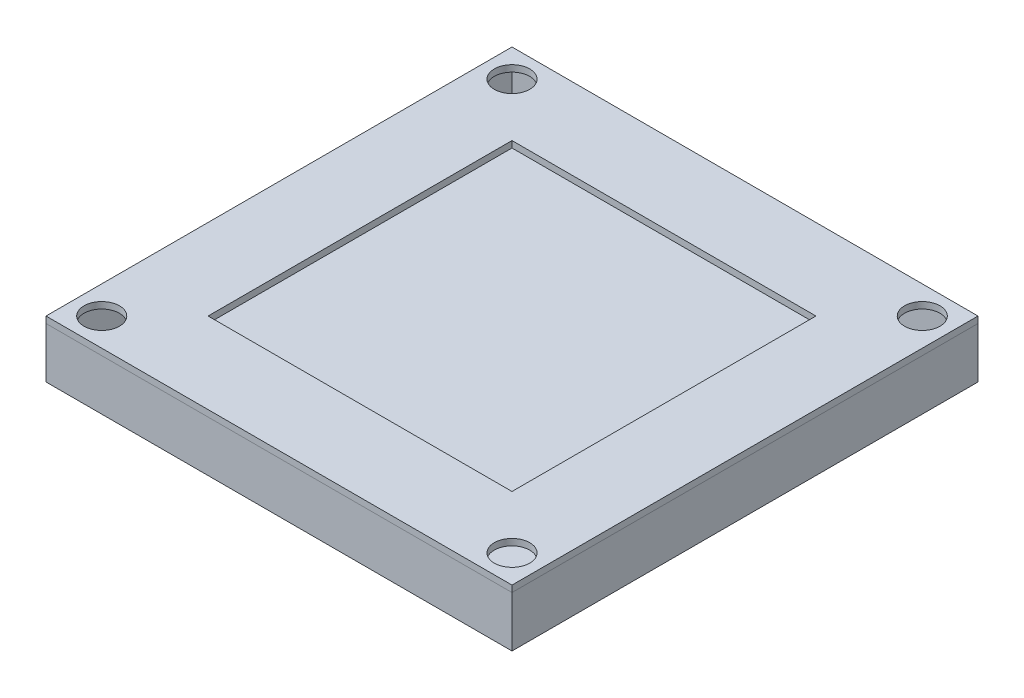
ISO-10303-21;
HEADER;
FILE_DESCRIPTION(('STEP AP214'),'2;1');
FILE_NAME('part.step','',(''),(''),'','','');
FILE_SCHEMA(('AUTOMOTIVE_DESIGN { 1 0 10303 214 1 1 1 1 }'));
ENDSEC;
DATA;
#1=APPLICATION_CONTEXT('core data for automotive mechanical design processes');
#2=APPLICATION_PROTOCOL_DEFINITION('international standard','automotive_design',2000,#1);
#3=PRODUCT_CONTEXT('',#1,'mechanical');
#4=PRODUCT('Part','Part','',(#3));
#5=PRODUCT_RELATED_PRODUCT_CATEGORY('part','',(#4));
#6=PRODUCT_DEFINITION_FORMATION('','',#4);
#7=PRODUCT_DEFINITION_CONTEXT('part definition',#1,'design');
#8=PRODUCT_DEFINITION('design','',#6,#7);
#9=PRODUCT_DEFINITION_SHAPE('','',#8);
#10=(LENGTH_UNIT() NAMED_UNIT(*) SI_UNIT(.MILLI.,.METRE.));
#11=(NAMED_UNIT(*) PLANE_ANGLE_UNIT() SI_UNIT($,.RADIAN.));
#12=(NAMED_UNIT(*) SI_UNIT($,.STERADIAN.) SOLID_ANGLE_UNIT());
#13=UNCERTAINTY_MEASURE_WITH_UNIT(LENGTH_MEASURE(1.E-05),#10,'distance_accuracy_value','');
#14=(GEOMETRIC_REPRESENTATION_CONTEXT(3) GLOBAL_UNCERTAINTY_ASSIGNED_CONTEXT((#13)) GLOBAL_UNIT_ASSIGNED_CONTEXT((#10,
#11,#12)) REPRESENTATION_CONTEXT('',''));
#15=CARTESIAN_POINT('',(0.,0.,0.));
#16=DIRECTION('',(0.,0.,1.));
#17=DIRECTION('',(1.,0.,0.));
#18=AXIS2_PLACEMENT_3D('',#15,#16,#17);
#19=CARTESIAN_POINT('',(0.,35.814,0.));
#20=DIRECTION('',(0.,1.,0.));
#21=DIRECTION('',(0.,0.,1.));
#22=AXIS2_PLACEMENT_3D('',#19,#20,#21);
#23=PLANE('',#22);
#24=CARTESIAN_POINT('',(128.5875,35.814,128.5875));
#25=DIRECTION('',(0.,1.,0.));
#26=DIRECTION('',(0.,0.,1.));
#27=AXIS2_PLACEMENT_3D('',#24,#25,#26);
#28=CIRCLE('',#27,11.1125);
#29=CARTESIAN_POINT('',(128.5875,35.814,139.7));
#30=VERTEX_POINT('',#29);
#31=EDGE_CURVE('E154',#30,#30,#28,.T.);
#32=ORIENTED_EDGE('',*,*,#31,.F.);
#33=EDGE_LOOP('',(#32));
#34=FACE_BOUND('',#33,.T.);
#35=CARTESIAN_POINT('',(-128.5875,35.814,-128.5875));
#36=DIRECTION('',(0.,1.,0.));
#37=DIRECTION('',(0.,0.,1.));
#38=AXIS2_PLACEMENT_3D('',#35,#36,#37);
#39=CIRCLE('',#38,11.1125);
#40=CARTESIAN_POINT('',(-128.5875,35.814,-117.475));
#41=VERTEX_POINT('',#40);
#42=EDGE_CURVE('E166',#41,#41,#39,.T.);
#43=ORIENTED_EDGE('',*,*,#42,.F.);
#44=EDGE_LOOP('',(#43));
#45=FACE_BOUND('',#44,.T.);
#46=DIRECTION('',(1.,0.,0.));
#47=VECTOR('',#46,1.);
#48=CARTESIAN_POINT('',(-146.05,35.814,146.05));
#49=LINE('',#48,#47);
#50=CARTESIAN_POINT('',(-146.05,35.814,146.05));
#51=VERTEX_POINT('',#50);
#52=CARTESIAN_POINT('',(146.05,35.814,146.05));
#53=VERTEX_POINT('',#52);
#54=EDGE_CURVE('E172',#51,#53,#49,.T.);
#55=ORIENTED_EDGE('',*,*,#54,.T.);
#56=DIRECTION('',(0.,0.,-1.));
#57=VECTOR('',#56,1.);
#58=CARTESIAN_POINT('',(146.05,35.814,146.05));
#59=LINE('',#58,#57);
#60=CARTESIAN_POINT('',(146.05,35.814,-146.05));
#61=VERTEX_POINT('',#60);
#62=EDGE_CURVE('E175',#53,#61,#59,.T.);
#63=ORIENTED_EDGE('',*,*,#62,.T.);
#64=DIRECTION('',(-1.,0.,0.));
#65=VECTOR('',#64,1.);
#66=CARTESIAN_POINT('',(146.05,35.814,-146.05));
#67=LINE('',#66,#65);
#68=CARTESIAN_POINT('',(-146.05,35.814,-146.05));
#69=VERTEX_POINT('',#68);
#70=EDGE_CURVE('E178',#61,#69,#67,.T.);
#71=ORIENTED_EDGE('',*,*,#70,.T.);
#72=DIRECTION('',(0.,0.,1.));
#73=VECTOR('',#72,1.);
#74=CARTESIAN_POINT('',(-146.05,35.814,-146.05));
#75=LINE('',#74,#73);
#76=EDGE_CURVE('E180',#69,#51,#75,.T.);
#77=ORIENTED_EDGE('',*,*,#76,.T.);
#78=EDGE_LOOP('',(#55,#63,#71,#77));
#79=FACE_BOUND('',#78,.T.);
#80=CARTESIAN_POINT('',(-128.5875,35.814,128.5875));
#81=DIRECTION('',(0.,1.,0.));
#82=DIRECTION('',(0.,0.,1.));
#83=AXIS2_PLACEMENT_3D('',#80,#81,#82);
#84=CIRCLE('',#83,11.1125);
#85=CARTESIAN_POINT('',(-128.5875,35.814,139.7));
#86=VERTEX_POINT('',#85);
#87=EDGE_CURVE('E160',#86,#86,#84,.T.);
#88=ORIENTED_EDGE('',*,*,#87,.F.);
#89=EDGE_LOOP('',(#88));
#90=FACE_BOUND('',#89,.T.);
#91=CARTESIAN_POINT('',(128.5875,35.814,-128.5875));
#92=DIRECTION('',(0.,1.,0.));
#93=DIRECTION('',(0.,0.,1.));
#94=AXIS2_PLACEMENT_3D('',#91,#92,#93);
#95=CIRCLE('',#94,11.1125);
#96=CARTESIAN_POINT('',(128.5875,35.814,-117.475));
#97=VERTEX_POINT('',#96);
#98=EDGE_CURVE('E148',#97,#97,#95,.T.);
#99=ORIENTED_EDGE('',*,*,#98,.F.);
#100=EDGE_LOOP('',(#99));
#101=FACE_BOUND('',#100,.T.);
#102=DIRECTION('',(-1.,0.,0.));
#103=VECTOR('',#102,1.);
#104=CARTESIAN_POINT('',(-95.25,35.814,-95.2499999999999));
#105=LINE('',#104,#103);
#106=CARTESIAN_POINT('',(95.25,35.814,-95.2499999999999));
#107=VERTEX_POINT('',#106);
#108=CARTESIAN_POINT('',(-95.25,35.814,-95.2499999999999));
#109=VERTEX_POINT('',#108);
#110=EDGE_CURVE('E120',#107,#109,#105,.T.);
#111=ORIENTED_EDGE('',*,*,#110,.F.);
#112=DIRECTION('',(0.,0.,-1.));
#113=VECTOR('',#112,1.);
#114=CARTESIAN_POINT('',(95.25,35.814,-95.2499999999999));
#115=LINE('',#114,#113);
#116=CARTESIAN_POINT('',(95.25,35.814,95.2500000000001));
#117=VERTEX_POINT('',#116);
#118=EDGE_CURVE('E112',#117,#107,#115,.T.);
#119=ORIENTED_EDGE('',*,*,#118,.F.);
#120=DIRECTION('',(1.,0.,0.));
#121=VECTOR('',#120,1.);
#122=CARTESIAN_POINT('',(-95.25,35.814,95.2500000000001));
#123=LINE('',#122,#121);
#124=CARTESIAN_POINT('',(-95.25,35.814,95.2500000000001));
#125=VERTEX_POINT('',#124);
#126=EDGE_CURVE('E134',#125,#117,#123,.T.);
#127=ORIENTED_EDGE('',*,*,#126,.F.);
#128=DIRECTION('',(0.,0.,1.));
#129=VECTOR('',#128,1.);
#130=CARTESIAN_POINT('',(-95.25,35.814,-95.2499999999999));
#131=LINE('',#130,#129);
#132=EDGE_CURVE('E132',#109,#125,#131,.T.);
#133=ORIENTED_EDGE('',*,*,#132,.F.);
#134=EDGE_LOOP('',(#111,#119,#127,#133));
#135=FACE_BOUND('',#134,.T.);
#136=ADVANCED_FACE('F47',(#34,#45,#79,#90,#101,#135),#23,.T.);
#137=CARTESIAN_POINT('',(0.,31.75,0.));
#138=DIRECTION('',(0.,1.,0.));
#139=DIRECTION('',(0.,0.,1.));
#140=AXIS2_PLACEMENT_3D('',#137,#138,#139);
#141=PLANE('',#140);
#142=CARTESIAN_POINT('',(128.5875,31.75,-128.5875));
#143=DIRECTION('',(0.,1.,0.));
#144=DIRECTION('',(0.,0.,1.));
#145=AXIS2_PLACEMENT_3D('',#142,#143,#144);
#146=CIRCLE('',#145,11.1125);
#147=CARTESIAN_POINT('',(128.5875,31.75,-117.475));
#148=VERTEX_POINT('',#147);
#149=EDGE_CURVE('E128',#148,#148,#146,.T.);
#150=ORIENTED_EDGE('',*,*,#149,.T.);
#151=EDGE_LOOP('',(#150));
#152=FACE_BOUND('',#151,.T.);
#153=CARTESIAN_POINT('',(128.5875,31.75,128.5875));
#154=DIRECTION('',(0.,1.,0.));
#155=DIRECTION('',(0.,0.,1.));
#156=AXIS2_PLACEMENT_3D('',#153,#154,#155);
#157=CIRCLE('',#156,11.1125);
#158=CARTESIAN_POINT('',(128.5875,31.75,139.7));
#159=VERTEX_POINT('',#158);
#160=EDGE_CURVE('E151',#159,#159,#157,.T.);
#161=ORIENTED_EDGE('',*,*,#160,.T.);
#162=EDGE_LOOP('',(#161));
#163=FACE_BOUND('',#162,.T.);
#164=CARTESIAN_POINT('',(-128.5875,31.75,128.5875));
#165=DIRECTION('',(0.,1.,0.));
#166=DIRECTION('',(0.,0.,1.));
#167=AXIS2_PLACEMENT_3D('',#164,#165,#166);
#168=CIRCLE('',#167,11.1125);
#169=CARTESIAN_POINT('',(-128.5875,31.75,139.7));
#170=VERTEX_POINT('',#169);
#171=EDGE_CURVE('E157',#170,#170,#168,.T.);
#172=ORIENTED_EDGE('',*,*,#171,.T.);
#173=EDGE_LOOP('',(#172));
#174=FACE_BOUND('',#173,.T.);
#175=CARTESIAN_POINT('',(-128.5875,31.75,-128.5875));
#176=DIRECTION('',(0.,1.,0.));
#177=DIRECTION('',(0.,0.,1.));
#178=AXIS2_PLACEMENT_3D('',#175,#176,#177);
#179=CIRCLE('',#178,11.1125);
#180=CARTESIAN_POINT('',(-128.5875,31.75,-117.475));
#181=VERTEX_POINT('',#180);
#182=EDGE_CURVE('E163',#181,#181,#179,.T.);
#183=ORIENTED_EDGE('',*,*,#182,.T.);
#184=EDGE_LOOP('',(#183));
#185=FACE_BOUND('',#184,.T.);
#186=DIRECTION('',(1.,0.,0.));
#187=VECTOR('',#186,1.);
#188=CARTESIAN_POINT('',(-146.05,31.75,146.05));
#189=LINE('',#188,#187);
#190=CARTESIAN_POINT('',(-146.05,31.75,146.05));
#191=VERTEX_POINT('',#190);
#192=CARTESIAN_POINT('',(146.05,31.75,146.05));
#193=VERTEX_POINT('',#192);
#194=EDGE_CURVE('E169',#191,#193,#189,.T.);
#195=ORIENTED_EDGE('',*,*,#194,.F.);
#196=DIRECTION('',(0.,0.,1.));
#197=VECTOR('',#196,1.);
#198=CARTESIAN_POINT('',(-146.05,31.75,-146.05));
#199=LINE('',#198,#197);
#200=CARTESIAN_POINT('',(-146.05,31.75,-146.05));
#201=VERTEX_POINT('',#200);
#202=EDGE_CURVE('E176',#201,#191,#199,.T.);
#203=ORIENTED_EDGE('',*,*,#202,.F.);
#204=DIRECTION('',(-1.,0.,0.));
#205=VECTOR('',#204,1.);
#206=CARTESIAN_POINT('',(146.05,31.75,-146.05));
#207=LINE('',#206,#205);
#208=CARTESIAN_POINT('',(146.05,31.75,-146.05));
#209=VERTEX_POINT('',#208);
#210=EDGE_CURVE('E187',#209,#201,#207,.T.);
#211=ORIENTED_EDGE('',*,*,#210,.F.);
#212=DIRECTION('',(0.,0.,-1.));
#213=VECTOR('',#212,1.);
#214=CARTESIAN_POINT('',(146.05,31.75,146.05));
#215=LINE('',#214,#213);
#216=EDGE_CURVE('E185',#193,#209,#215,.T.);
#217=ORIENTED_EDGE('',*,*,#216,.F.);
#218=EDGE_LOOP('',(#195,#203,#211,#217));
#219=FACE_BOUND('',#218,.T.);
#220=DIRECTION('',(0.,0.,-1.));
#221=VECTOR('',#220,1.);
#222=CARTESIAN_POINT('',(95.25,31.75,-95.2499999999999));
#223=LINE('',#222,#221);
#224=CARTESIAN_POINT('',(95.25,31.75,95.2500000000001));
#225=VERTEX_POINT('',#224);
#226=CARTESIAN_POINT('',(95.25,31.75,-95.2499999999999));
#227=VERTEX_POINT('',#226);
#228=EDGE_CURVE('E70',#225,#227,#223,.T.);
#229=ORIENTED_EDGE('',*,*,#228,.T.);
#230=DIRECTION('',(-1.,0.,0.));
#231=VECTOR('',#230,1.);
#232=CARTESIAN_POINT('',(-95.25,31.75,-95.2499999999999));
#233=LINE('',#232,#231);
#234=CARTESIAN_POINT('',(-95.25,31.75,-95.2499999999999));
#235=VERTEX_POINT('',#234);
#236=EDGE_CURVE('E127',#227,#235,#233,.T.);
#237=ORIENTED_EDGE('',*,*,#236,.T.);
#238=DIRECTION('',(0.,0.,1.));
#239=VECTOR('',#238,1.);
#240=CARTESIAN_POINT('',(-95.25,31.75,-95.2499999999999));
#241=LINE('',#240,#239);
#242=CARTESIAN_POINT('',(-95.25,31.75,95.2500000000001));
#243=VERTEX_POINT('',#242);
#244=EDGE_CURVE('E140',#235,#243,#241,.T.);
#245=ORIENTED_EDGE('',*,*,#244,.T.);
#246=DIRECTION('',(1.,0.,0.));
#247=VECTOR('',#246,1.);
#248=CARTESIAN_POINT('',(-95.25,31.75,95.2500000000001));
#249=LINE('',#248,#247);
#250=EDGE_CURVE('E121',#243,#225,#249,.T.);
#251=ORIENTED_EDGE('',*,*,#250,.T.);
#252=EDGE_LOOP('',(#229,#237,#245,#251));
#253=FACE_BOUND('',#252,.T.);
#254=ADVANCED_FACE('F205',(#152,#163,#174,#185,#219,#253),#141,.F.);
#255=CARTESIAN_POINT('',(-146.05,35.814,146.05));
#256=DIRECTION('',(0.,0.,-1.));
#257=DIRECTION('',(-1.,0.,0.));
#258=AXIS2_PLACEMENT_3D('',#255,#256,#257);
#259=PLANE('',#258);
#260=ORIENTED_EDGE('',*,*,#194,.T.);
#261=DIRECTION('',(0.,-1.,0.));
#262=VECTOR('',#261,1.);
#263=CARTESIAN_POINT('',(146.05,35.814,146.05));
#264=LINE('',#263,#262);
#265=EDGE_CURVE('E12',#53,#193,#264,.T.);
#266=ORIENTED_EDGE('',*,*,#265,.F.);
#267=ORIENTED_EDGE('',*,*,#54,.F.);
#268=DIRECTION('',(0.,-1.,0.));
#269=VECTOR('',#268,1.);
#270=CARTESIAN_POINT('',(-146.05,35.814,146.05));
#271=LINE('',#270,#269);
#272=EDGE_CURVE('E182',#51,#191,#271,.T.);
#273=ORIENTED_EDGE('',*,*,#272,.T.);
#274=EDGE_LOOP('',(#260,#266,#267,#273));
#275=FACE_BOUND('',#274,.T.);
#276=ADVANCED_FACE('F49',(#275),#259,.F.);
#277=CARTESIAN_POINT('',(146.05,35.814,146.05));
#278=DIRECTION('',(-1.,0.,0.));
#279=DIRECTION('',(0.,0.,1.));
#280=AXIS2_PLACEMENT_3D('',#277,#278,#279);
#281=PLANE('',#280);
#282=ORIENTED_EDGE('',*,*,#216,.T.);
#283=DIRECTION('',(0.,-1.,0.));
#284=VECTOR('',#283,1.);
#285=CARTESIAN_POINT('',(146.05,35.814,-146.05));
#286=LINE('',#285,#284);
#287=EDGE_CURVE('E55',#61,#209,#286,.T.);
#288=ORIENTED_EDGE('',*,*,#287,.F.);
#289=ORIENTED_EDGE('',*,*,#62,.F.);
#290=ORIENTED_EDGE('',*,*,#265,.T.);
#291=EDGE_LOOP('',(#282,#288,#289,#290));
#292=FACE_BOUND('',#291,.T.);
#293=ADVANCED_FACE('F216',(#292),#281,.F.);
#294=CARTESIAN_POINT('',(146.05,35.814,-146.05));
#295=DIRECTION('',(0.,0.,1.));
#296=DIRECTION('',(1.,0.,0.));
#297=AXIS2_PLACEMENT_3D('',#294,#295,#296);
#298=PLANE('',#297);
#299=ORIENTED_EDGE('',*,*,#210,.T.);
#300=DIRECTION('',(0.,-1.,0.));
#301=VECTOR('',#300,1.);
#302=CARTESIAN_POINT('',(-146.05,35.814,-146.05));
#303=LINE('',#302,#301);
#304=EDGE_CURVE('E192',#69,#201,#303,.T.);
#305=ORIENTED_EDGE('',*,*,#304,.F.);
#306=ORIENTED_EDGE('',*,*,#70,.F.);
#307=ORIENTED_EDGE('',*,*,#287,.T.);
#308=EDGE_LOOP('',(#299,#305,#306,#307));
#309=FACE_BOUND('',#308,.T.);
#310=ADVANCED_FACE('F199',(#309),#298,.F.);
#311=CARTESIAN_POINT('',(-146.05,35.814,-146.05));
#312=DIRECTION('',(1.,0.,0.));
#313=DIRECTION('',(0.,0.,-1.));
#314=AXIS2_PLACEMENT_3D('',#311,#312,#313);
#315=PLANE('',#314);
#316=ORIENTED_EDGE('',*,*,#202,.T.);
#317=ORIENTED_EDGE('',*,*,#272,.F.);
#318=ORIENTED_EDGE('',*,*,#76,.F.);
#319=ORIENTED_EDGE('',*,*,#304,.T.);
#320=EDGE_LOOP('',(#316,#317,#318,#319));
#321=FACE_BOUND('',#320,.T.);
#322=ADVANCED_FACE('F209',(#321),#315,.F.);
#323=CARTESIAN_POINT('',(-128.5875,35.814,-128.5875));
#324=DIRECTION('',(0.,-1.,0.));
#325=DIRECTION('',(0.,0.,-1.));
#326=AXIS2_PLACEMENT_3D('',#323,#324,#325);
#327=CYLINDRICAL_SURFACE('',#326,11.1125);
#328=ORIENTED_EDGE('',*,*,#42,.T.);
#329=EDGE_LOOP('',(#328));
#330=FACE_BOUND('',#329,.T.);
#331=ORIENTED_EDGE('',*,*,#182,.F.);
#332=EDGE_LOOP('',(#331));
#333=FACE_BOUND('',#332,.T.);
#334=ADVANCED_FACE('F234',(#330,#333),#327,.F.);
#335=CARTESIAN_POINT('',(-128.5875,35.814,128.5875));
#336=DIRECTION('',(0.,-1.,0.));
#337=DIRECTION('',(0.,0.,-1.));
#338=AXIS2_PLACEMENT_3D('',#335,#336,#337);
#339=CYLINDRICAL_SURFACE('',#338,11.1125);
#340=ORIENTED_EDGE('',*,*,#87,.T.);
#341=EDGE_LOOP('',(#340));
#342=FACE_BOUND('',#341,.T.);
#343=ORIENTED_EDGE('',*,*,#171,.F.);
#344=EDGE_LOOP('',(#343));
#345=FACE_BOUND('',#344,.T.);
#346=ADVANCED_FACE('F241',(#342,#345),#339,.F.);
#347=CARTESIAN_POINT('',(128.5875,35.814,128.5875));
#348=DIRECTION('',(0.,-1.,0.));
#349=DIRECTION('',(0.,0.,-1.));
#350=AXIS2_PLACEMENT_3D('',#347,#348,#349);
#351=CYLINDRICAL_SURFACE('',#350,11.1125);
#352=ORIENTED_EDGE('',*,*,#31,.T.);
#353=EDGE_LOOP('',(#352));
#354=FACE_BOUND('',#353,.T.);
#355=ORIENTED_EDGE('',*,*,#160,.F.);
#356=EDGE_LOOP('',(#355));
#357=FACE_BOUND('',#356,.T.);
#358=ADVANCED_FACE('F246',(#354,#357),#351,.F.);
#359=CARTESIAN_POINT('',(128.5875,35.814,-128.5875));
#360=DIRECTION('',(0.,-1.,0.));
#361=DIRECTION('',(0.,0.,-1.));
#362=AXIS2_PLACEMENT_3D('',#359,#360,#361);
#363=CYLINDRICAL_SURFACE('',#362,11.1125);
#364=ORIENTED_EDGE('',*,*,#98,.T.);
#365=EDGE_LOOP('',(#364));
#366=FACE_BOUND('',#365,.T.);
#367=ORIENTED_EDGE('',*,*,#149,.F.);
#368=EDGE_LOOP('',(#367));
#369=FACE_BOUND('',#368,.T.);
#370=ADVANCED_FACE('F255',(#366,#369),#363,.F.);
#371=CARTESIAN_POINT('',(95.25,35.814,-95.2499999999999));
#372=DIRECTION('',(-1.,0.,0.));
#373=DIRECTION('',(0.,0.,1.));
#374=AXIS2_PLACEMENT_3D('',#371,#372,#373);
#375=PLANE('',#374);
#376=ORIENTED_EDGE('',*,*,#228,.F.);
#377=DIRECTION('',(0.,-1.,0.));
#378=VECTOR('',#377,1.);
#379=CARTESIAN_POINT('',(95.25,35.814,95.2500000000001));
#380=LINE('',#379,#378);
#381=EDGE_CURVE('E116',#117,#225,#380,.T.);
#382=ORIENTED_EDGE('',*,*,#381,.F.);
#383=ORIENTED_EDGE('',*,*,#118,.T.);
#384=DIRECTION('',(0.,-1.,0.));
#385=VECTOR('',#384,1.);
#386=CARTESIAN_POINT('',(95.25,35.814,-95.2499999999999));
#387=LINE('',#386,#385);
#388=EDGE_CURVE('E115',#107,#227,#387,.T.);
#389=ORIENTED_EDGE('',*,*,#388,.T.);
#390=EDGE_LOOP('',(#376,#382,#383,#389));
#391=FACE_BOUND('',#390,.T.);
#392=ADVANCED_FACE('F114',(#391),#375,.T.);
#393=CARTESIAN_POINT('',(-95.25,35.814,-95.2499999999999));
#394=DIRECTION('',(0.,0.,1.));
#395=DIRECTION('',(1.,0.,0.));
#396=AXIS2_PLACEMENT_3D('',#393,#394,#395);
#397=PLANE('',#396);
#398=ORIENTED_EDGE('',*,*,#236,.F.);
#399=ORIENTED_EDGE('',*,*,#388,.F.);
#400=ORIENTED_EDGE('',*,*,#110,.T.);
#401=DIRECTION('',(0.,-1.,0.));
#402=VECTOR('',#401,1.);
#403=CARTESIAN_POINT('',(-95.25,35.814,-95.2499999999999));
#404=LINE('',#403,#402);
#405=EDGE_CURVE('E129',#109,#235,#404,.T.);
#406=ORIENTED_EDGE('',*,*,#405,.T.);
#407=EDGE_LOOP('',(#398,#399,#400,#406));
#408=FACE_BOUND('',#407,.T.);
#409=ADVANCED_FACE('F124',(#408),#397,.T.);
#410=CARTESIAN_POINT('',(-95.25,35.814,-95.2499999999999));
#411=DIRECTION('',(1.,0.,0.));
#412=DIRECTION('',(0.,0.,-1.));
#413=AXIS2_PLACEMENT_3D('',#410,#411,#412);
#414=PLANE('',#413);
#415=ORIENTED_EDGE('',*,*,#244,.F.);
#416=ORIENTED_EDGE('',*,*,#405,.F.);
#417=ORIENTED_EDGE('',*,*,#132,.T.);
#418=DIRECTION('',(0.,-1.,0.));
#419=VECTOR('',#418,1.);
#420=CARTESIAN_POINT('',(-95.25,35.814,95.2500000000001));
#421=LINE('',#420,#419);
#422=EDGE_CURVE('E62',#125,#243,#421,.T.);
#423=ORIENTED_EDGE('',*,*,#422,.T.);
#424=EDGE_LOOP('',(#415,#416,#417,#423));
#425=FACE_BOUND('',#424,.T.);
#426=ADVANCED_FACE('F267',(#425),#414,.T.);
#427=CARTESIAN_POINT('',(-95.25,35.814,95.2500000000001));
#428=DIRECTION('',(0.,0.,-1.));
#429=DIRECTION('',(-1.,0.,0.));
#430=AXIS2_PLACEMENT_3D('',#427,#428,#429);
#431=PLANE('',#430);
#432=ORIENTED_EDGE('',*,*,#250,.F.);
#433=ORIENTED_EDGE('',*,*,#422,.F.);
#434=ORIENTED_EDGE('',*,*,#126,.T.);
#435=ORIENTED_EDGE('',*,*,#381,.T.);
#436=EDGE_LOOP('',(#432,#433,#434,#435));
#437=FACE_BOUND('',#436,.T.);
#438=ADVANCED_FACE('F270',(#437),#431,.T.);
#439=CLOSED_SHELL('',(#136,#254,#276,#293,#310,#322,#334,#346,#358,#370,#392,#409,#426,#438));
#440=MANIFOLD_SOLID_BREP('B2',#439);
#441=CARTESIAN_POINT('',(-141.986,31.75,-141.986));
#442=DIRECTION('',(1.,0.,0.));
#443=DIRECTION('',(0.,0.,-1.));
#444=AXIS2_PLACEMENT_3D('',#441,#442,#443);
#445=PLANE('',#444);
#446=DIRECTION('',(0.,-1.,0.));
#447=VECTOR('',#446,1.);
#448=CARTESIAN_POINT('',(-141.986,31.75,141.986));
#449=LINE('',#448,#447);
#450=CARTESIAN_POINT('',(-141.986,31.75,141.986));
#451=VERTEX_POINT('',#450);
#452=CARTESIAN_POINT('',(-141.986,1.524,141.986));
#453=VERTEX_POINT('',#452);
#454=EDGE_CURVE('E433',#451,#453,#449,.T.);
#455=ORIENTED_EDGE('',*,*,#454,.T.);
#456=DIRECTION('',(0.,0.,-1.));
#457=VECTOR('',#456,1.);
#458=CARTESIAN_POINT('',(-141.986,1.524,-141.986));
#459=LINE('',#458,#457);
#460=CARTESIAN_POINT('',(-141.986,1.524,-141.986));
#461=VERTEX_POINT('',#460);
#462=EDGE_CURVE('E424',#453,#461,#459,.T.);
#463=ORIENTED_EDGE('',*,*,#462,.T.);
#464=DIRECTION('',(0.,-1.,0.));
#465=VECTOR('',#464,1.);
#466=CARTESIAN_POINT('',(-141.986,31.75,-141.986));
#467=LINE('',#466,#465);
#468=CARTESIAN_POINT('',(-141.986,31.75,-141.986));
#469=VERTEX_POINT('',#468);
#470=EDGE_CURVE('E430',#469,#461,#467,.T.);
#471=ORIENTED_EDGE('',*,*,#470,.F.);
#472=DIRECTION('',(0.,0.,1.));
#473=VECTOR('',#472,1.);
#474=CARTESIAN_POINT('',(-141.986,31.75,-141.986));
#475=LINE('',#474,#473);
#476=EDGE_CURVE('E434',#469,#451,#475,.T.);
#477=ORIENTED_EDGE('',*,*,#476,.T.);
#478=EDGE_LOOP('',(#455,#463,#471,#477));
#479=FACE_BOUND('',#478,.T.);
#480=ADVANCED_FACE('F361',(#479),#445,.T.);
#481=CARTESIAN_POINT('',(141.986,31.75,141.986));
#482=DIRECTION('',(0.,0.,-1.));
#483=DIRECTION('',(-1.,0.,0.));
#484=AXIS2_PLACEMENT_3D('',#481,#482,#483);
#485=PLANE('',#484);
#486=DIRECTION('',(0.,-1.,0.));
#487=VECTOR('',#486,1.);
#488=CARTESIAN_POINT('',(141.986,31.75,141.986));
#489=LINE('',#488,#487);
#490=CARTESIAN_POINT('',(141.986,31.75,141.986));
#491=VERTEX_POINT('',#490);
#492=CARTESIAN_POINT('',(141.986,1.524,141.986));
#493=VERTEX_POINT('',#492);
#494=EDGE_CURVE('E441',#491,#493,#489,.T.);
#495=ORIENTED_EDGE('',*,*,#494,.T.);
#496=DIRECTION('',(-1.,0.,0.));
#497=VECTOR('',#496,1.);
#498=CARTESIAN_POINT('',(141.986,1.524,141.986));
#499=LINE('',#498,#497);
#500=EDGE_CURVE('E435',#493,#453,#499,.T.);
#501=ORIENTED_EDGE('',*,*,#500,.T.);
#502=ORIENTED_EDGE('',*,*,#454,.F.);
#503=DIRECTION('',(1.,0.,0.));
#504=VECTOR('',#503,1.);
#505=CARTESIAN_POINT('',(141.986,31.75,141.986));
#506=LINE('',#505,#504);
#507=EDGE_CURVE('E503',#451,#491,#506,.T.);
#508=ORIENTED_EDGE('',*,*,#507,.T.);
#509=EDGE_LOOP('',(#495,#501,#502,#508));
#510=FACE_BOUND('',#509,.T.);
#511=ADVANCED_FACE('F512',(#510),#485,.T.);
#512=CARTESIAN_POINT('',(141.986,31.75,-141.986));
#513=DIRECTION('',(-1.,0.,0.));
#514=DIRECTION('',(0.,0.,1.));
#515=AXIS2_PLACEMENT_3D('',#512,#513,#514);
#516=PLANE('',#515);
#517=DIRECTION('',(0.,-1.,0.));
#518=VECTOR('',#517,1.);
#519=CARTESIAN_POINT('',(141.986,31.75,-141.986));
#520=LINE('',#519,#518);
#521=CARTESIAN_POINT('',(141.986,31.75,-141.986));
#522=VERTEX_POINT('',#521);
#523=CARTESIAN_POINT('',(141.986,1.524,-141.986));
#524=VERTEX_POINT('',#523);
#525=EDGE_CURVE('E382',#522,#524,#520,.T.);
#526=ORIENTED_EDGE('',*,*,#525,.T.);
#527=DIRECTION('',(0.,0.,1.));
#528=VECTOR('',#527,1.);
#529=CARTESIAN_POINT('',(141.986,1.524,-141.986));
#530=LINE('',#529,#528);
#531=EDGE_CURVE('E376',#524,#493,#530,.T.);
#532=ORIENTED_EDGE('',*,*,#531,.T.);
#533=ORIENTED_EDGE('',*,*,#494,.F.);
#534=DIRECTION('',(0.,0.,-1.));
#535=VECTOR('',#534,1.);
#536=CARTESIAN_POINT('',(141.986,31.75,-141.986));
#537=LINE('',#536,#535);
#538=EDGE_CURVE('E443',#491,#522,#537,.T.);
#539=ORIENTED_EDGE('',*,*,#538,.T.);
#540=EDGE_LOOP('',(#526,#532,#533,#539));
#541=FACE_BOUND('',#540,.T.);
#542=ADVANCED_FACE('F511',(#541),#516,.T.);
#543=CARTESIAN_POINT('',(141.986,31.75,-141.986));
#544=DIRECTION('',(0.,0.,1.));
#545=DIRECTION('',(1.,0.,0.));
#546=AXIS2_PLACEMENT_3D('',#543,#544,#545);
#547=PLANE('',#546);
#548=ORIENTED_EDGE('',*,*,#470,.T.);
#549=DIRECTION('',(1.,0.,0.));
#550=VECTOR('',#549,1.);
#551=CARTESIAN_POINT('',(141.986,1.524,-141.986));
#552=LINE('',#551,#550);
#553=EDGE_CURVE('E45',#461,#524,#552,.T.);
#554=ORIENTED_EDGE('',*,*,#553,.T.);
#555=ORIENTED_EDGE('',*,*,#525,.F.);
#556=DIRECTION('',(-1.,0.,0.));
#557=VECTOR('',#556,1.);
#558=CARTESIAN_POINT('',(141.986,31.75,-141.986));
#559=LINE('',#558,#557);
#560=EDGE_CURVE('E439',#522,#469,#559,.T.);
#561=ORIENTED_EDGE('',*,*,#560,.T.);
#562=EDGE_LOOP('',(#548,#554,#555,#561));
#563=FACE_BOUND('',#562,.T.);
#564=ADVANCED_FACE('F437',(#563),#547,.T.);
#565=CARTESIAN_POINT('',(0.,31.75,0.));
#566=DIRECTION('',(0.,1.,0.));
#567=DIRECTION('',(0.,0.,1.));
#568=AXIS2_PLACEMENT_3D('',#565,#566,#567);
#569=PLANE('',#568);
#570=DIRECTION('',(0.,0.,-1.));
#571=VECTOR('',#570,1.);
#572=CARTESIAN_POINT('',(146.05,31.75,-146.05));
#573=LINE('',#572,#571);
#574=CARTESIAN_POINT('',(146.05,31.75,146.05));
#575=VERTEX_POINT('',#574);
#576=CARTESIAN_POINT('',(146.05,31.75,-146.05));
#577=VERTEX_POINT('',#576);
#578=EDGE_CURVE('E451',#575,#577,#573,.T.);
#579=ORIENTED_EDGE('',*,*,#578,.T.);
#580=DIRECTION('',(-1.,0.,0.));
#581=VECTOR('',#580,1.);
#582=CARTESIAN_POINT('',(-146.05,31.75,-146.05));
#583=LINE('',#582,#581);
#584=CARTESIAN_POINT('',(-146.05,31.75,-146.05));
#585=VERTEX_POINT('',#584);
#586=EDGE_CURVE('E454',#577,#585,#583,.T.);
#587=ORIENTED_EDGE('',*,*,#586,.T.);
#588=DIRECTION('',(0.,0.,1.));
#589=VECTOR('',#588,1.);
#590=CARTESIAN_POINT('',(-146.05,31.75,-146.05));
#591=LINE('',#590,#589);
#592=CARTESIAN_POINT('',(-146.05,31.75,146.05));
#593=VERTEX_POINT('',#592);
#594=EDGE_CURVE('E457',#585,#593,#591,.T.);
#595=ORIENTED_EDGE('',*,*,#594,.T.);
#596=DIRECTION('',(1.,0.,0.));
#597=VECTOR('',#596,1.);
#598=CARTESIAN_POINT('',(-146.05,31.75,146.05));
#599=LINE('',#598,#597);
#600=EDGE_CURVE('E459',#593,#575,#599,.T.);
#601=ORIENTED_EDGE('',*,*,#600,.T.);
#602=EDGE_LOOP('',(#579,#587,#595,#601));
#603=FACE_BOUND('',#602,.T.);
#604=ORIENTED_EDGE('',*,*,#507,.F.);
#605=ORIENTED_EDGE('',*,*,#476,.F.);
#606=ORIENTED_EDGE('',*,*,#560,.F.);
#607=ORIENTED_EDGE('',*,*,#538,.F.);
#608=EDGE_LOOP('',(#604,#605,#606,#607));
#609=FACE_BOUND('',#608,.T.);
#610=ADVANCED_FACE('F497',(#603,#609),#569,.T.);
#611=CARTESIAN_POINT('',(0.,0.,0.));
#612=DIRECTION('',(0.,1.,0.));
#613=DIRECTION('',(0.,0.,1.));
#614=AXIS2_PLACEMENT_3D('',#611,#612,#613);
#615=PLANE('',#614);
#616=DIRECTION('',(0.,0.,-1.));
#617=VECTOR('',#616,1.);
#618=CARTESIAN_POINT('',(146.05,0.,-146.05));
#619=LINE('',#618,#617);
#620=CARTESIAN_POINT('',(146.05,0.,146.05));
#621=VERTEX_POINT('',#620);
#622=CARTESIAN_POINT('',(146.05,0.,-146.05));
#623=VERTEX_POINT('',#622);
#624=EDGE_CURVE('E450',#621,#623,#619,.T.);
#625=ORIENTED_EDGE('',*,*,#624,.F.);
#626=DIRECTION('',(1.,0.,0.));
#627=VECTOR('',#626,1.);
#628=CARTESIAN_POINT('',(-146.05,0.,146.05));
#629=LINE('',#628,#627);
#630=CARTESIAN_POINT('',(-146.05,0.,146.05));
#631=VERTEX_POINT('',#630);
#632=EDGE_CURVE('E455',#631,#621,#629,.T.);
#633=ORIENTED_EDGE('',*,*,#632,.F.);
#634=DIRECTION('',(0.,0.,1.));
#635=VECTOR('',#634,1.);
#636=CARTESIAN_POINT('',(-146.05,0.,-146.05));
#637=LINE('',#636,#635);
#638=CARTESIAN_POINT('',(-146.05,0.,-146.05));
#639=VERTEX_POINT('',#638);
#640=EDGE_CURVE('E467',#639,#631,#637,.T.);
#641=ORIENTED_EDGE('',*,*,#640,.F.);
#642=DIRECTION('',(-1.,0.,0.));
#643=VECTOR('',#642,1.);
#644=CARTESIAN_POINT('',(-146.05,0.,-146.05));
#645=LINE('',#644,#643);
#646=EDGE_CURVE('E464',#623,#639,#645,.T.);
#647=ORIENTED_EDGE('',*,*,#646,.F.);
#648=EDGE_LOOP('',(#625,#633,#641,#647));
#649=FACE_BOUND('',#648,.T.);
#650=ADVANCED_FACE('F486',(#649),#615,.F.);
#651=CARTESIAN_POINT('',(146.05,31.75,-146.05));
#652=DIRECTION('',(-1.,0.,0.));
#653=DIRECTION('',(0.,0.,1.));
#654=AXIS2_PLACEMENT_3D('',#651,#652,#653);
#655=PLANE('',#654);
#656=ORIENTED_EDGE('',*,*,#624,.T.);
#657=DIRECTION('',(0.,-1.,0.));
#658=VECTOR('',#657,1.);
#659=CARTESIAN_POINT('',(146.05,31.75,-146.05));
#660=LINE('',#659,#658);
#661=EDGE_CURVE('E369',#577,#623,#660,.T.);
#662=ORIENTED_EDGE('',*,*,#661,.F.);
#663=ORIENTED_EDGE('',*,*,#578,.F.);
#664=DIRECTION('',(0.,-1.,0.));
#665=VECTOR('',#664,1.);
#666=CARTESIAN_POINT('',(146.05,31.75,146.05));
#667=LINE('',#666,#665);
#668=EDGE_CURVE('E461',#575,#621,#667,.T.);
#669=ORIENTED_EDGE('',*,*,#668,.T.);
#670=EDGE_LOOP('',(#656,#662,#663,#669));
#671=FACE_BOUND('',#670,.T.);
#672=ADVANCED_FACE('F363',(#671),#655,.F.);
#673=CARTESIAN_POINT('',(-146.05,31.75,-146.05));
#674=DIRECTION('',(0.,0.,1.));
#675=DIRECTION('',(1.,0.,0.));
#676=AXIS2_PLACEMENT_3D('',#673,#674,#675);
#677=PLANE('',#676);
#678=ORIENTED_EDGE('',*,*,#646,.T.);
#679=DIRECTION('',(0.,-1.,0.));
#680=VECTOR('',#679,1.);
#681=CARTESIAN_POINT('',(-146.05,31.75,-146.05));
#682=LINE('',#681,#680);
#683=EDGE_CURVE('E475',#585,#639,#682,.T.);
#684=ORIENTED_EDGE('',*,*,#683,.F.);
#685=ORIENTED_EDGE('',*,*,#586,.F.);
#686=ORIENTED_EDGE('',*,*,#661,.T.);
#687=EDGE_LOOP('',(#678,#684,#685,#686));
#688=FACE_BOUND('',#687,.T.);
#689=ADVANCED_FACE('F479',(#688),#677,.F.);
#690=CARTESIAN_POINT('',(-146.05,31.75,-146.05));
#691=DIRECTION('',(1.,0.,0.));
#692=DIRECTION('',(0.,0.,-1.));
#693=AXIS2_PLACEMENT_3D('',#690,#691,#692);
#694=PLANE('',#693);
#695=ORIENTED_EDGE('',*,*,#640,.T.);
#696=DIRECTION('',(0.,-1.,0.));
#697=VECTOR('',#696,1.);
#698=CARTESIAN_POINT('',(-146.05,31.75,146.05));
#699=LINE('',#698,#697);
#700=EDGE_CURVE('E473',#593,#631,#699,.T.);
#701=ORIENTED_EDGE('',*,*,#700,.F.);
#702=ORIENTED_EDGE('',*,*,#594,.F.);
#703=ORIENTED_EDGE('',*,*,#683,.T.);
#704=EDGE_LOOP('',(#695,#701,#702,#703));
#705=FACE_BOUND('',#704,.T.);
#706=ADVANCED_FACE('F495',(#705),#694,.F.);
#707=CARTESIAN_POINT('',(-146.05,31.75,146.05));
#708=DIRECTION('',(0.,0.,-1.));
#709=DIRECTION('',(-1.,0.,0.));
#710=AXIS2_PLACEMENT_3D('',#707,#708,#709);
#711=PLANE('',#710);
#712=ORIENTED_EDGE('',*,*,#632,.T.);
#713=ORIENTED_EDGE('',*,*,#668,.F.);
#714=ORIENTED_EDGE('',*,*,#600,.F.);
#715=ORIENTED_EDGE('',*,*,#700,.T.);
#716=EDGE_LOOP('',(#712,#713,#714,#715));
#717=FACE_BOUND('',#716,.T.);
#718=ADVANCED_FACE('F491',(#717),#711,.F.);
#719=CARTESIAN_POINT('',(0.,1.524,0.));
#720=DIRECTION('',(0.,-1.,0.));
#721=DIRECTION('',(0.,0.,-1.));
#722=AXIS2_PLACEMENT_3D('',#719,#720,#721);
#723=PLANE('',#722);
#724=ORIENTED_EDGE('',*,*,#462,.F.);
#725=ORIENTED_EDGE('',*,*,#500,.F.);
#726=ORIENTED_EDGE('',*,*,#531,.F.);
#727=ORIENTED_EDGE('',*,*,#553,.F.);
#728=EDGE_LOOP('',(#724,#725,#726,#727));
#729=FACE_BOUND('',#728,.T.);
#730=ADVANCED_FACE('F423',(#729),#723,.F.);
#731=CLOSED_SHELL('',(#480,#511,#542,#564,#610,#650,#672,#689,#706,#718,#730));
#732=MANIFOLD_SOLID_BREP('B6',#731);
#733=ADVANCED_BREP_SHAPE_REPRESENTATION('',(#18,#440,#732),#14);
#734=SHAPE_DEFINITION_REPRESENTATION(#9,#733);
ENDSEC;
END-ISO-10303-21;
